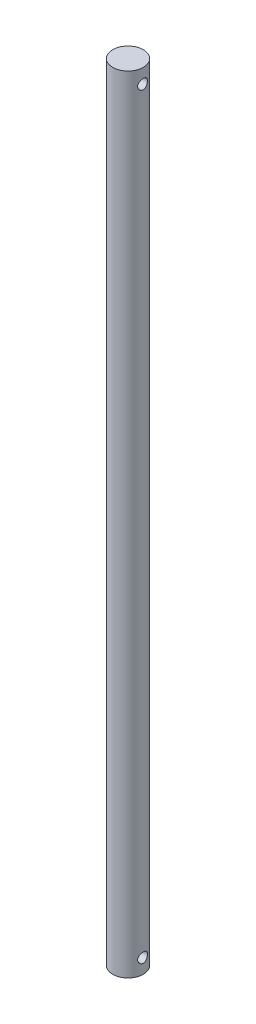
ISO-10303-21;
HEADER;
FILE_DESCRIPTION(('STEP AP214'),'2;1');
FILE_NAME('part.step','',(''),(''),'','','');
FILE_SCHEMA(('AUTOMOTIVE_DESIGN { 1 0 10303 214 1 1 1 1 }'));
ENDSEC;
DATA;
#1=APPLICATION_CONTEXT('core data for automotive mechanical design processes');
#2=APPLICATION_PROTOCOL_DEFINITION('international standard','automotive_design',2000,#1);
#3=PRODUCT_CONTEXT('',#1,'mechanical');
#4=PRODUCT('Part','Part','',(#3));
#5=PRODUCT_RELATED_PRODUCT_CATEGORY('part','',(#4));
#6=PRODUCT_DEFINITION_FORMATION('','',#4);
#7=PRODUCT_DEFINITION_CONTEXT('part definition',#1,'design');
#8=PRODUCT_DEFINITION('design','',#6,#7);
#9=PRODUCT_DEFINITION_SHAPE('','',#8);
#10=(LENGTH_UNIT() NAMED_UNIT(*) SI_UNIT(.MILLI.,.METRE.));
#11=(NAMED_UNIT(*) PLANE_ANGLE_UNIT() SI_UNIT($,.RADIAN.));
#12=(NAMED_UNIT(*) SI_UNIT($,.STERADIAN.) SOLID_ANGLE_UNIT());
#13=UNCERTAINTY_MEASURE_WITH_UNIT(LENGTH_MEASURE(1.E-05),#10,'distance_accuracy_value','');
#14=(GEOMETRIC_REPRESENTATION_CONTEXT(3) GLOBAL_UNCERTAINTY_ASSIGNED_CONTEXT((#13)) GLOBAL_UNIT_ASSIGNED_CONTEXT((#10,
#11,#12)) REPRESENTATION_CONTEXT('',''));
#15=CARTESIAN_POINT('',(0.,0.,0.));
#16=DIRECTION('',(0.,0.,1.));
#17=DIRECTION('',(1.,0.,0.));
#18=AXIS2_PLACEMENT_3D('',#15,#16,#17);
#19=CARTESIAN_POINT('',(-0.0135864605530802,317.499999740234,3.22569211686021E-06));
#20=DIRECTION('',(0.,-1.,0.));
#21=DIRECTION('',(0.,0.,-1.));
#22=AXIS2_PLACEMENT_3D('',#19,#20,#21);
#23=CYLINDRICAL_SURFACE('',#22,2.4765);
#24=CARTESIAN_POINT('',(2.33226374512929,315.150499740234,-0.793746774307883));
#25=CARTESIAN_POINT('',(2.3322638720806,315.107161951607,-0.793746659067901));
#26=CARTESIAN_POINT('',(2.33347783006624,315.063822763622,-0.790185455128073));
#27=CARTESIAN_POINT('',(2.33817962713619,314.978421694986,-0.776078213579906));
#28=CARTESIAN_POINT('',(2.34166798783358,314.936360109657,-0.765530573688706));
#29=CARTESIAN_POINT('',(2.35048377617049,314.854764161139,-0.737853650818829));
#30=CARTESIAN_POINT('',(2.35580781678064,314.815225301366,-0.720736482800176));
#31=CARTESIAN_POINT('',(2.36769029088564,314.739568795668,-0.680447194285241));
#32=CARTESIAN_POINT('',(2.37424896348936,314.703451814493,-0.657273900572333));
#33=CARTESIAN_POINT('',(2.38812761607114,314.634358708059,-0.604632971364002));
#34=CARTESIAN_POINT('',(2.39546550872294,314.601524423591,-0.574983842867584));
#35=CARTESIAN_POINT('',(2.40992377340049,314.54119844977,-0.510620847699191));
#36=CARTESIAN_POINT('',(2.41704411325302,314.513707547441,-0.475906236251031));
#37=CARTESIAN_POINT('',(2.43047084396854,314.464216142471,-0.401371632775677));
#38=CARTESIAN_POINT('',(2.4367536954662,314.442362674135,-0.361449395449789));
#39=CARTESIAN_POINT('',(2.44758765756123,314.405736357688,-0.278260134681632));
#40=CARTESIAN_POINT('',(2.45213919752994,314.390961753757,-0.234993943758401));
#41=CARTESIAN_POINT('',(2.45887087923491,314.369388947971,-0.147830863300199));
#42=CARTESIAN_POINT('',(2.46112299164932,314.362348106448,-0.103999687677426));
#43=CARTESIAN_POINT('',(2.46325673967616,314.355672877823,-0.0157241038574345));
#44=CARTESIAN_POINT('',(2.46313894130591,314.356036722225,0.0287201553800426));
#45=CARTESIAN_POINT('',(2.46059574789193,314.364003074777,0.11524891403087));
#46=CARTESIAN_POINT('',(2.45825426737939,314.37134236023,0.157360511383579));
#47=CARTESIAN_POINT('',(2.45163081803287,314.392618080572,0.239719284112542));
#48=CARTESIAN_POINT('',(2.44734872056888,314.406554952771,0.279966335706056));
#49=CARTESIAN_POINT('',(2.4372147280458,314.440793458128,0.358048826335696));
#50=CARTESIAN_POINT('',(2.43134373284034,314.461173076805,0.395847488207291));
#51=CARTESIAN_POINT('',(2.41864772356659,314.507655388132,0.467568851892471));
#52=CARTESIAN_POINT('',(2.41182245903003,314.533759584346,0.501490531847619));
#53=CARTESIAN_POINT('',(2.39758953455254,314.59229213642,0.566063323430721));
#54=CARTESIAN_POINT('',(2.39016945844752,314.62494711323,0.596506567639749));
#55=CARTESIAN_POINT('',(2.37583851777917,314.694966048912,0.651548715340272));
#56=CARTESIAN_POINT('',(2.36892771994684,314.732330623153,0.676146853880458));
#57=CARTESIAN_POINT('',(2.35633310853477,314.811322208458,0.719059433940293));
#58=CARTESIAN_POINT('',(2.35066543101075,314.852995991295,0.737292871364853));
#59=CARTESIAN_POINT('',(2.3413869899267,314.939048604288,0.76641606938776));
#60=CARTESIAN_POINT('',(2.33777544154698,314.983426395162,0.777308632272911));
#61=CARTESIAN_POINT('',(2.33319366164506,315.071627326616,0.791031516325646));
#62=CARTESIAN_POINT('',(2.3321187256203,315.115395289946,0.794181665050452));
#63=CARTESIAN_POINT('',(2.33244042127192,315.202838796846,0.79323123037019));
#64=CARTESIAN_POINT('',(2.33383664639995,315.246514354434,0.789131839638651));
#65=CARTESIAN_POINT('',(2.3388395861054,315.331127264649,0.774085130543362));
#66=CARTESIAN_POINT('',(2.34237660731152,315.372107526878,0.763353500789346));
#67=CARTESIAN_POINT('',(2.35118769296395,315.451679828202,0.735602278765456));
#68=CARTESIAN_POINT('',(2.3564620502544,315.490271463368,0.718581626363416));
#69=CARTESIAN_POINT('',(2.36834881103916,315.565246683961,0.678156515188634));
#70=CARTESIAN_POINT('',(2.37499645889659,315.601529958732,0.654576648503994));
#71=CARTESIAN_POINT('',(2.38880956165207,315.669740860338,0.601904943901511));
#72=CARTESIAN_POINT('',(2.39597515764123,315.701667293459,0.572811600563982));
#73=CARTESIAN_POINT('',(2.41039767078414,315.761706246417,0.50841930323414));
#74=CARTESIAN_POINT('',(2.41764476896747,315.789589580677,0.472903867353075));
#75=CARTESIAN_POINT('',(2.43110067545878,315.839011932415,0.397521502155126));
#76=CARTESIAN_POINT('',(2.43730952784539,315.86055121926,0.357654757691512));
#77=CARTESIAN_POINT('',(2.4479560523787,315.896469991021,0.274931401907327));
#78=CARTESIAN_POINT('',(2.45240610014041,315.910899685847,0.23209826778952));
#79=CARTESIAN_POINT('',(2.4590877590758,315.932298489898,0.144444284542477));
#80=CARTESIAN_POINT('',(2.46132010432531,315.939270067875,0.0996240982771408));
#81=CARTESIAN_POINT('',(2.46326362126126,315.945345910257,0.011372774796502));
#82=CARTESIAN_POINT('',(2.46308062712895,315.944780419281,-0.0320335559444066));
#83=CARTESIAN_POINT('',(2.46047020281845,315.936602846605,-0.118104392606053));
#84=CARTESIAN_POINT('',(2.4580429321187,315.928991265601,-0.160768951017712));
#85=CARTESIAN_POINT('',(2.45125224254238,315.90715138847,-0.243566054908952));
#86=CARTESIAN_POINT('',(2.44691588497238,315.893015444317,-0.283725335972743));
#87=CARTESIAN_POINT('',(2.43675378306693,315.858612239659,-0.36112018441276));
#88=CARTESIAN_POINT('',(2.43092777734012,315.838343902976,-0.398355237168733));
#89=CARTESIAN_POINT('',(2.41813684096934,315.791429571259,-0.470268337851682));
#90=CARTESIAN_POINT('',(2.41113910229626,315.764584626978,-0.50481069391093));
#91=CARTESIAN_POINT('',(2.3968824550372,315.705625225307,-0.569009356969976));
#92=CARTESIAN_POINT('',(2.38962346688261,315.673509151704,-0.598664159761723));
#93=CARTESIAN_POINT('',(2.37535977929936,315.603558590676,-0.653307559295509));
#94=CARTESIAN_POINT('',(2.36837315967445,315.565562001826,-0.678093974760554));
#95=CARTESIAN_POINT('',(2.35576854860231,315.485729393547,-0.720905754521589));
#96=CARTESIAN_POINT('',(2.35015007567692,315.443894731969,-0.738933498537812));
#97=CARTESIAN_POINT('',(2.34131406919759,315.360584826032,-0.76660786404493));
#98=CARTESIAN_POINT('',(2.33795573757894,315.31929030894,-0.776753781821836));
#99=CARTESIAN_POINT('',(2.33343082094454,315.235497328965,-0.79032234973179));
#100=CARTESIAN_POINT('',(2.3322636206337,315.192999207472,-0.793746887318675));
#101=CARTESIAN_POINT('',(2.33226374512929,315.150499740234,-0.793746774307883));
#102=B_SPLINE_CURVE_WITH_KNOTS('',3,(#24,#25,#26,#27,#28,#29,#30,#31,#32,#33,#34,#35,#36,#37,
#38,#39,#40,#41,#42,#43,#44,#45,#46,#47,#48,#49,#50,#51,#52,#53,#54,#55,#56,#57,#58,#59,#60,#61,
#62,#63,#64,#65,#66,#67,#68,#69,#70,#71,#72,#73,#74,#75,#76,#77,#78,#79,#80,#81,#82,#83,#84,#85,
#86,#87,#88,#89,#90,#91,#92,#93,#94,#95,#96,#97,#98,#99,#100,#101),.UNSPECIFIED.,.T.,.F.,(4,2,2,
2,2,2,2,2,2,2,2,2,2,2,2,2,2,2,2,2,2,2,2,2,2,2,2,2,2,2,2,2,2,2,2,2,2,2,4),(0.,0.129856228298272,
0.259742248393923,0.389389885879715,0.519062657860358,0.652987864208083,0.786932781410178,
0.924081160580036,1.06119550425941,1.19387292907763,1.32651866627756,1.45434973259645,
1.58218927318891,1.7116396376826,1.84112404318447,1.97627031595293,2.11143426563914,
2.24826059788337,2.38503466876043,2.51605603964839,2.64705585727983,2.77400457984901,
2.90097471176527,3.03173530604888,3.16253165525558,3.29907442759584,3.43561140155144,
3.5711697752869,3.70668326323884,3.83627935673075,3.96586624182343,4.09367257775078,
4.22150135550505,4.35381858050624,4.48617645211741,4.62321657140636,4.76020839361328,
4.88758847255119,5.01493277633134),.UNSPECIFIED.);
#103=CARTESIAN_POINT('',(2.33226374512929,315.150499740234,-0.793746774307883));
#104=VERTEX_POINT('',#103);
#105=EDGE_CURVE('E56',#104,#104,#102,.T.);
#106=ORIENTED_EDGE('',*,*,#105,.T.);
#107=EDGE_LOOP('',(#106));
#108=FACE_BOUND('',#107,.T.);
#109=CARTESIAN_POINT('',(-0.0135864605530802,317.499999740234,3.22569211686021E-06));
#110=DIRECTION('',(0.,1.,0.));
#111=DIRECTION('',(0.,0.,1.));
#112=AXIS2_PLACEMENT_3D('',#109,#110,#111);
#113=CIRCLE('',#112,2.4765);
#114=CARTESIAN_POINT('',(-0.0135864605530802,317.499999740234,2.47650322569212));
#115=VERTEX_POINT('',#114);
#116=EDGE_CURVE('E10',#115,#115,#113,.T.);
#117=ORIENTED_EDGE('',*,*,#116,.F.);
#118=EDGE_LOOP('',(#117));
#119=FACE_BOUND('',#118,.T.);
#120=CARTESIAN_POINT('',(-0.0135864605530802,190.499999740234,3.22569211686021E-06));
#121=DIRECTION('',(0.,1.,0.));
#122=DIRECTION('',(0.,0.,1.));
#123=AXIS2_PLACEMENT_3D('',#120,#121,#122);
#124=CIRCLE('',#123,2.4765);
#125=CARTESIAN_POINT('',(-0.0135864605530802,190.499999740234,2.47650322569212));
#126=VERTEX_POINT('',#125);
#127=EDGE_CURVE('E51',#126,#126,#124,.T.);
#128=ORIENTED_EDGE('',*,*,#127,.T.);
#129=EDGE_LOOP('',(#128));
#130=FACE_BOUND('',#129,.T.);
#131=CARTESIAN_POINT('',(2.33226374512929,192.849499740234,-0.793746774307883));
#132=CARTESIAN_POINT('',(2.3322638720806,192.892837528862,-0.793746659067899));
#133=CARTESIAN_POINT('',(2.33347783006624,192.936176716847,-0.790185455128067));
#134=CARTESIAN_POINT('',(2.33817962713619,193.021577785483,-0.776078213579903));
#135=CARTESIAN_POINT('',(2.34166798783358,193.063639370812,-0.765530573688708));
#136=CARTESIAN_POINT('',(2.35048377617049,193.14523531933,-0.73785365081883));
#137=CARTESIAN_POINT('',(2.35580781678064,193.184774179103,-0.720736482800171));
#138=CARTESIAN_POINT('',(2.36769029088564,193.260430684801,-0.680447194285232));
#139=CARTESIAN_POINT('',(2.37424896348936,193.296547665976,-0.657273900572328));
#140=CARTESIAN_POINT('',(2.38812761607114,193.36564077241,-0.604632971364001));
#141=CARTESIAN_POINT('',(2.39546550872294,193.398475056878,-0.574983842867581));
#142=CARTESIAN_POINT('',(2.40992377340049,193.458801030699,-0.510620847699192));
#143=CARTESIAN_POINT('',(2.41704411325302,193.486291933028,-0.475906236251037));
#144=CARTESIAN_POINT('',(2.43047084396854,193.535783337998,-0.401371632775683));
#145=CARTESIAN_POINT('',(2.4367536954662,193.557636806334,-0.36144939544979));
#146=CARTESIAN_POINT('',(2.44758765756123,193.594263122781,-0.278260134681633));
#147=CARTESIAN_POINT('',(2.45213919752994,193.609037726712,-0.234993943758404));
#148=CARTESIAN_POINT('',(2.45887087923491,193.630610532498,-0.147830863300205));
#149=CARTESIAN_POINT('',(2.46112299164932,193.637651374021,-0.103999687677433));
#150=CARTESIAN_POINT('',(2.46325673967616,193.644326602645,-0.0157241038574385));
#151=CARTESIAN_POINT('',(2.46313894130591,193.643962758244,0.028720155380042));
#152=CARTESIAN_POINT('',(2.46059574789193,193.635996405692,0.115248914030866));
#153=CARTESIAN_POINT('',(2.45825426737939,193.628657120239,0.157360511383569));
#154=CARTESIAN_POINT('',(2.45163081803287,193.607381399897,0.239719284112533));
#155=CARTESIAN_POINT('',(2.44734872056888,193.593444527698,0.279966335706056));
#156=CARTESIAN_POINT('',(2.4372147280458,193.559206022341,0.358048826335702));
#157=CARTESIAN_POINT('',(2.43134373284034,193.538826403664,0.395847488207293));
#158=CARTESIAN_POINT('',(2.41864772356659,193.492344092336,0.46756885189247));
#159=CARTESIAN_POINT('',(2.41182245903003,193.466239896123,0.501490531847619));
#160=CARTESIAN_POINT('',(2.39758953455254,193.407707344048,0.566063323430733));
#161=CARTESIAN_POINT('',(2.39016945844752,193.375052367238,0.596506567639771));
#162=CARTESIAN_POINT('',(2.37583851777917,193.305033431557,0.65154871534029));
#163=CARTESIAN_POINT('',(2.36892771994684,193.267668857316,0.676146853880462));
#164=CARTESIAN_POINT('',(2.35633310853477,193.18867727201,0.719059433940283));
#165=CARTESIAN_POINT('',(2.35066543101075,193.147003489174,0.737292871364844));
#166=CARTESIAN_POINT('',(2.34138698992671,193.06095087618,0.766416069387755));
#167=CARTESIAN_POINT('',(2.33777544154698,193.016573085307,0.777308632272909));
#168=CARTESIAN_POINT('',(2.33319366164506,192.928372153853,0.791031516325647));
#169=CARTESIAN_POINT('',(2.3321187256203,192.884604190523,0.794181665050453));
#170=CARTESIAN_POINT('',(2.33244042127192,192.797160683623,0.79323123037019));
#171=CARTESIAN_POINT('',(2.33383664639995,192.753485126035,0.78913183963865));
#172=CARTESIAN_POINT('',(2.3388395861054,192.66887221582,0.774085130543363));
#173=CARTESIAN_POINT('',(2.34237660731152,192.627891953591,0.76335350078935));
#174=CARTESIAN_POINT('',(2.35118769296394,192.548319652267,0.735602278765464));
#175=CARTESIAN_POINT('',(2.35646205025439,192.509728017101,0.718581626363422));
#176=CARTESIAN_POINT('',(2.36834881103916,192.434752796508,0.678156515188642));
#177=CARTESIAN_POINT('',(2.37499645889659,192.398469521736,0.654576648504007));
#178=CARTESIAN_POINT('',(2.38880956165207,192.330258620131,0.601904943901519));
#179=CARTESIAN_POINT('',(2.39597515764123,192.29833218701,0.572811600563979));
#180=CARTESIAN_POINT('',(2.41039767078415,192.238293234052,0.508419303234133));
#181=CARTESIAN_POINT('',(2.41764476896747,192.210409899792,0.472903867353076));
#182=CARTESIAN_POINT('',(2.43110067545878,192.160987548054,0.397521502155137));
#183=CARTESIAN_POINT('',(2.43730952784539,192.139448261209,0.357654757691525));
#184=CARTESIAN_POINT('',(2.4479560523787,192.103529489447,0.274931401907341));
#185=CARTESIAN_POINT('',(2.45240610014041,192.089099794622,0.232098267789535));
#186=CARTESIAN_POINT('',(2.4590877590758,192.067700990571,0.144444284542487));
#187=CARTESIAN_POINT('',(2.46132010432531,192.060729412594,0.0996240982771471));
#188=CARTESIAN_POINT('',(2.46326362126126,192.054653570212,0.0113727747965044));
#189=CARTESIAN_POINT('',(2.46308062712895,192.055219061188,-0.0320335559444042));
#190=CARTESIAN_POINT('',(2.46047020281845,192.063396633864,-0.118104392606054));
#191=CARTESIAN_POINT('',(2.4580429321187,192.071008214868,-0.160768951017716));
#192=CARTESIAN_POINT('',(2.45125224254238,192.092848091999,-0.243566054908951));
#193=CARTESIAN_POINT('',(2.44691588497238,192.106984036152,-0.283725335972735));
#194=CARTESIAN_POINT('',(2.43675378306693,192.14138724081,-0.361120184412752));
#195=CARTESIAN_POINT('',(2.43092777734012,192.161655577492,-0.398355237168732));
#196=CARTESIAN_POINT('',(2.41813684096934,192.20856990921,-0.470268337851689));
#197=CARTESIAN_POINT('',(2.41113910229626,192.235414853491,-0.504810693910936));
#198=CARTESIAN_POINT('',(2.3968824550372,192.294374255162,-0.569009356969982));
#199=CARTESIAN_POINT('',(2.38962346688261,192.326490328765,-0.598664159761729));
#200=CARTESIAN_POINT('',(2.37535977929936,192.396440889793,-0.653307559295512));
#201=CARTESIAN_POINT('',(2.36837315967445,192.434437478643,-0.678093974760555));
#202=CARTESIAN_POINT('',(2.35576854860231,192.514270086922,-0.72090575452159));
#203=CARTESIAN_POINT('',(2.35015007567692,192.5561047485,-0.738933498537814));
#204=CARTESIAN_POINT('',(2.34131406919759,192.639414654437,-0.766607864044934));
#205=CARTESIAN_POINT('',(2.33795573757894,192.680709171529,-0.77675378182184));
#206=CARTESIAN_POINT('',(2.33343082094454,192.764502151504,-0.790322349731791));
#207=CARTESIAN_POINT('',(2.3322636206337,192.807000272997,-0.793746887318676));
#208=CARTESIAN_POINT('',(2.33226374512929,192.849499740234,-0.793746774307883));
#209=B_SPLINE_CURVE_WITH_KNOTS('',3,(#131,#132,#133,#134,#135,#136,#137,#138,#139,#140,#141,
#142,#143,#144,#145,#146,#147,#148,#149,#150,#151,#152,#153,#154,#155,#156,#157,#158,#159,#160,
#161,#162,#163,#164,#165,#166,#167,#168,#169,#170,#171,#172,#173,#174,#175,#176,#177,#178,#179,
#180,#181,#182,#183,#184,#185,#186,#187,#188,#189,#190,#191,#192,#193,#194,#195,#196,#197,#198,
#199,#200,#201,#202,#203,#204,#205,#206,#207,#208),.UNSPECIFIED.,.T.,.F.,(4,2,2,2,2,2,2,2,2,2,2,
2,2,2,2,2,2,2,2,2,2,2,2,2,2,2,2,2,2,2,2,2,2,2,2,2,2,2,4),(0.,0.129856228298272,
0.259742248393949,0.389389885879747,0.519062657860335,0.652987864208061,0.786932781410173,
0.924081160580016,1.06119550425939,1.19387292907761,1.32651866627754,1.45434973259642,
1.58218927318888,1.71163963768259,1.84112404318446,1.97627031595295,2.11143426563915,
2.24826059788335,2.38503466876041,2.51605603964838,2.64705585727979,2.77400457984894,
2.90097471176522,3.03173530604883,3.16253165525555,3.29907442759581,3.4356114015514,
3.57116977528686,3.7066832632388,3.83627935673072,3.9658662418234,4.09367257775075,
4.22150135550502,4.35381858050621,4.4861764521174,4.62321657140634,4.76020839361327,
4.88758847255121,5.01493277633132),.UNSPECIFIED.);
#210=CARTESIAN_POINT('',(2.33226374512929,192.849499740234,-0.793746774307883));
#211=VERTEX_POINT('',#210);
#212=EDGE_CURVE('E43',#211,#211,#209,.T.);
#213=ORIENTED_EDGE('',*,*,#212,.F.);
#214=EDGE_LOOP('',(#213));
#215=FACE_BOUND('',#214,.T.);
#216=ADVANCED_FACE('F39',(#108,#119,#130,#215),#23,.T.);
#217=CARTESIAN_POINT('',(-0.0135864605530802,317.499999740234,3.22569211686021E-06));
#218=DIRECTION('',(0.,1.,0.));
#219=DIRECTION('',(0.,0.,1.));
#220=AXIS2_PLACEMENT_3D('',#217,#218,#219);
#221=PLANE('',#220);
#222=ORIENTED_EDGE('',*,*,#116,.T.);
#223=EDGE_LOOP('',(#222));
#224=FACE_BOUND('',#223,.T.);
#225=ADVANCED_FACE('F74',(#224),#221,.T.);
#226=CARTESIAN_POINT('',(-0.0135864605530802,190.499999740234,3.22569211686021E-06));
#227=DIRECTION('',(0.,1.,0.));
#228=DIRECTION('',(0.,0.,1.));
#229=AXIS2_PLACEMENT_3D('',#226,#227,#228);
#230=PLANE('',#229);
#231=ORIENTED_EDGE('',*,*,#127,.F.);
#232=EDGE_LOOP('',(#231));
#233=FACE_BOUND('',#232,.T.);
#234=ADVANCED_FACE('F72',(#233),#230,.F.);
#235=CARTESIAN_POINT('',(-0.64858646055308,315.150499740234,3.22569211707705E-06));
#236=DIRECTION('',(1.,0.,0.));
#237=DIRECTION('',(0.,0.,-1.));
#238=AXIS2_PLACEMENT_3D('',#235,#236,#237);
#239=CYLINDRICAL_SURFACE('',#238,0.79375);
#240=CARTESIAN_POINT('',(-0.64858646055308,315.150499740234,3.22569211707705E-06));
#241=DIRECTION('',(1.,0.,0.));
#242=DIRECTION('',(0.,0.,-1.));
#243=AXIS2_PLACEMENT_3D('',#240,#241,#242);
#244=CIRCLE('',#243,0.79375);
#245=CARTESIAN_POINT('',(-0.64858646055308,315.150499740234,-0.793746774307883));
#246=VERTEX_POINT('',#245);
#247=EDGE_CURVE('E59',#246,#246,#244,.T.);
#248=ORIENTED_EDGE('',*,*,#247,.F.);
#249=EDGE_LOOP('',(#248));
#250=FACE_BOUND('',#249,.T.);
#251=ORIENTED_EDGE('',*,*,#105,.F.);
#252=EDGE_LOOP('',(#251));
#253=FACE_BOUND('',#252,.T.);
#254=ADVANCED_FACE('F66',(#250,#253),#239,.F.);
#255=CARTESIAN_POINT('',(-0.64858646055308,315.150499740234,3.22569211707705E-06));
#256=DIRECTION('',(1.,0.,0.));
#257=DIRECTION('',(0.,0.,-1.));
#258=AXIS2_PLACEMENT_3D('',#255,#256,#257);
#259=PLANE('',#258);
#260=ORIENTED_EDGE('',*,*,#247,.T.);
#261=EDGE_LOOP('',(#260));
#262=FACE_BOUND('',#261,.T.);
#263=ADVANCED_FACE('F71',(#262),#259,.T.);
#264=CARTESIAN_POINT('',(-0.64858646055308,192.849499740234,3.22569211707705E-06));
#265=DIRECTION('',(1.,0.,0.));
#266=DIRECTION('',(0.,0.,-1.));
#267=AXIS2_PLACEMENT_3D('',#264,#265,#266);
#268=CYLINDRICAL_SURFACE('',#267,0.79375);
#269=CARTESIAN_POINT('',(-0.64858646055308,192.849499740234,3.22569211707705E-06));
#270=DIRECTION('',(-1.,0.,0.));
#271=DIRECTION('',(0.,0.,-1.));
#272=AXIS2_PLACEMENT_3D('',#269,#270,#271);
#273=CIRCLE('',#272,0.79375);
#274=CARTESIAN_POINT('',(-0.64858646055308,192.849499740234,-0.793746774307883));
#275=VERTEX_POINT('',#274);
#276=EDGE_CURVE('E92',#275,#275,#273,.T.);
#277=ORIENTED_EDGE('',*,*,#276,.T.);
#278=EDGE_LOOP('',(#277));
#279=FACE_BOUND('',#278,.T.);
#280=ORIENTED_EDGE('',*,*,#212,.T.);
#281=EDGE_LOOP('',(#280));
#282=FACE_BOUND('',#281,.T.);
#283=ADVANCED_FACE('F97',(#279,#282),#268,.F.);
#284=CARTESIAN_POINT('',(-0.64858646055308,192.849499740234,3.22569211707705E-06));
#285=DIRECTION('',(1.,0.,0.));
#286=DIRECTION('',(0.,0.,-1.));
#287=AXIS2_PLACEMENT_3D('',#284,#285,#286);
#288=PLANE('',#287);
#289=ORIENTED_EDGE('',*,*,#276,.F.);
#290=EDGE_LOOP('',(#289));
#291=FACE_BOUND('',#290,.T.);
#292=ADVANCED_FACE('F99',(#291),#288,.T.);
#293=CLOSED_SHELL('',(#216,#225,#234,#254,#263,#283,#292));
#294=MANIFOLD_SOLID_BREP('B2',#293);
#295=ADVANCED_BREP_SHAPE_REPRESENTATION('',(#18,#294),#14);
#296=SHAPE_DEFINITION_REPRESENTATION(#9,#295);
ENDSEC;
END-ISO-10303-21;
